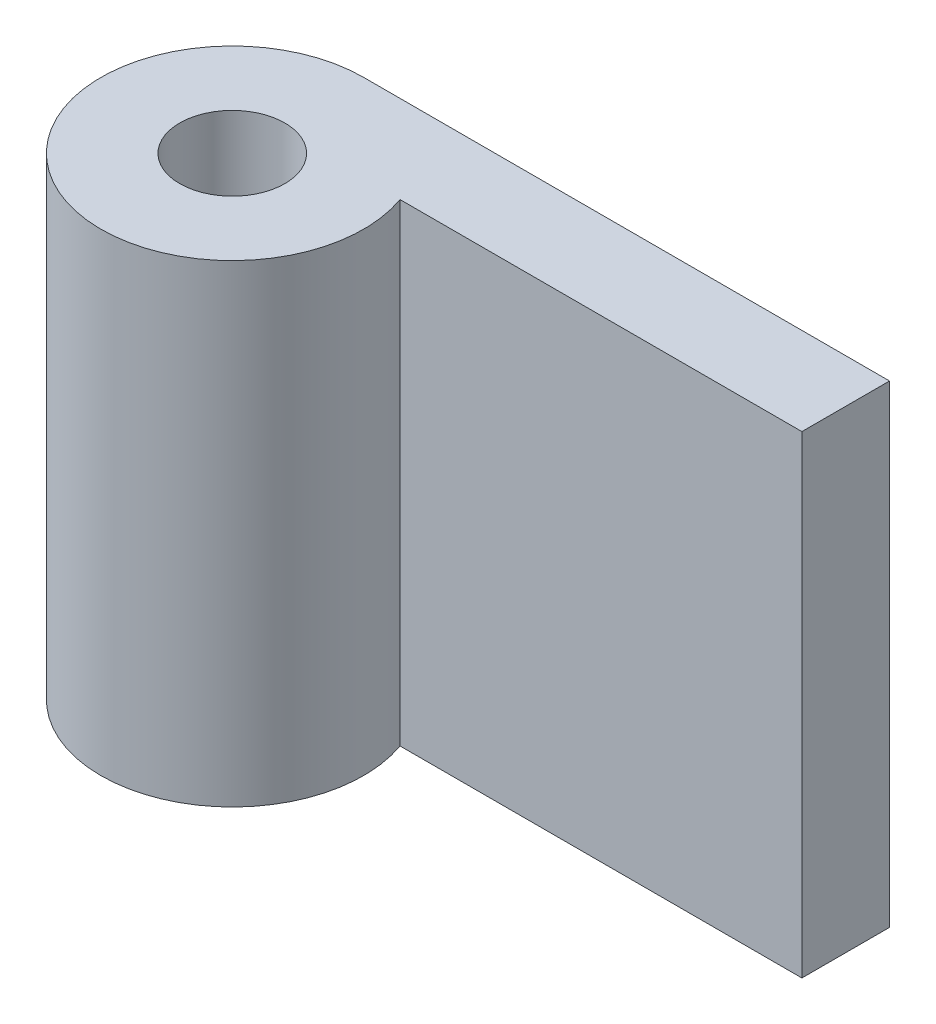
ISO-10303-21;
HEADER;
FILE_DESCRIPTION(('STEP AP214'),'2;1');
FILE_NAME('part.step','',(''),(''),'','','');
FILE_SCHEMA(('AUTOMOTIVE_DESIGN { 1 0 10303 214 1 1 1 1 }'));
ENDSEC;
DATA;
#1=APPLICATION_CONTEXT('core data for automotive mechanical design processes');
#2=APPLICATION_PROTOCOL_DEFINITION('international standard','automotive_design',2000,#1);
#3=PRODUCT_CONTEXT('',#1,'mechanical');
#4=PRODUCT('Part','Part','',(#3));
#5=PRODUCT_RELATED_PRODUCT_CATEGORY('part','',(#4));
#6=PRODUCT_DEFINITION_FORMATION('','',#4);
#7=PRODUCT_DEFINITION_CONTEXT('part definition',#1,'design');
#8=PRODUCT_DEFINITION('design','',#6,#7);
#9=PRODUCT_DEFINITION_SHAPE('','',#8);
#10=(LENGTH_UNIT() NAMED_UNIT(*) SI_UNIT(.MILLI.,.METRE.));
#11=(NAMED_UNIT(*) PLANE_ANGLE_UNIT() SI_UNIT($,.RADIAN.));
#12=(NAMED_UNIT(*) SI_UNIT($,.STERADIAN.) SOLID_ANGLE_UNIT());
#13=UNCERTAINTY_MEASURE_WITH_UNIT(LENGTH_MEASURE(1.E-05),#10,'distance_accuracy_value','');
#14=(GEOMETRIC_REPRESENTATION_CONTEXT(3) GLOBAL_UNCERTAINTY_ASSIGNED_CONTEXT((#13)) GLOBAL_UNIT_ASSIGNED_CONTEXT((#10,
#11,#12)) REPRESENTATION_CONTEXT('',''));
#15=CARTESIAN_POINT('',(0.,0.,0.));
#16=DIRECTION('',(0.,0.,1.));
#17=DIRECTION('',(1.,0.,0.));
#18=AXIS2_PLACEMENT_3D('',#15,#16,#17);
#19=CARTESIAN_POINT('',(0.,10.8,0.));
#20=DIRECTION('',(0.,-1.,0.));
#21=DIRECTION('',(0.,0.,-1.));
#22=AXIS2_PLACEMENT_3D('',#19,#20,#21);
#23=CYLINDRICAL_SURFACE('',#22,3.);
#24=DIRECTION('',(0.,-1.,0.));
#25=VECTOR('',#24,1.);
#26=CARTESIAN_POINT('',(2.82842712474619,10.8,-0.999999999999999));
#27=LINE('',#26,#25);
#28=CARTESIAN_POINT('',(2.82842712474619,10.8,-0.999999999999999));
#29=VERTEX_POINT('',#28);
#30=CARTESIAN_POINT('',(2.82842712474619,0.,-1.));
#31=VERTEX_POINT('',#30);
#32=EDGE_CURVE('E58',#29,#31,#27,.T.);
#33=ORIENTED_EDGE('',*,*,#32,.F.);
#34=CARTESIAN_POINT('',(0.,10.8,0.));
#35=DIRECTION('',(0.,1.,0.));
#36=DIRECTION('',(0.,0.,1.));
#37=AXIS2_PLACEMENT_3D('',#34,#35,#36);
#38=CIRCLE('',#37,3.);
#39=CARTESIAN_POINT('',(0.,10.8,-3.));
#40=VERTEX_POINT('',#39);
#41=EDGE_CURVE('E11',#40,#29,#38,.T.);
#42=ORIENTED_EDGE('',*,*,#41,.F.);
#43=DIRECTION('',(0.,1.,0.));
#44=VECTOR('',#43,1.);
#45=CARTESIAN_POINT('',(0.,10.8,-3.));
#46=LINE('',#45,#44);
#47=CARTESIAN_POINT('',(0.,0.,-3.));
#48=VERTEX_POINT('',#47);
#49=EDGE_CURVE('E62',#48,#40,#46,.T.);
#50=ORIENTED_EDGE('',*,*,#49,.F.);
#51=CARTESIAN_POINT('',(0.,0.,0.));
#52=DIRECTION('',(0.,1.,0.));
#53=DIRECTION('',(0.,0.,1.));
#54=AXIS2_PLACEMENT_3D('',#51,#52,#53);
#55=CIRCLE('',#54,3.);
#56=EDGE_CURVE('E46',#48,#31,#55,.T.);
#57=ORIENTED_EDGE('',*,*,#56,.T.);
#58=EDGE_LOOP('',(#33,#42,#50,#57));
#59=FACE_BOUND('',#58,.T.);
#60=ADVANCED_FACE('F43',(#59),#23,.T.);
#61=CARTESIAN_POINT('',(0.,10.8,0.));
#62=DIRECTION('',(0.,1.,0.));
#63=DIRECTION('',(0.,0.,1.));
#64=AXIS2_PLACEMENT_3D('',#61,#62,#63);
#65=PLANE('',#64);
#66=CARTESIAN_POINT('',(0.,10.8,0.));
#67=DIRECTION('',(0.,1.,0.));
#68=DIRECTION('',(0.,0.,1.));
#69=AXIS2_PLACEMENT_3D('',#66,#67,#68);
#70=CIRCLE('',#69,1.2);
#71=CARTESIAN_POINT('',(0.,10.8,1.2));
#72=VERTEX_POINT('',#71);
#73=EDGE_CURVE('E94',#72,#72,#70,.T.);
#74=ORIENTED_EDGE('',*,*,#73,.F.);
#75=EDGE_LOOP('',(#74));
#76=FACE_BOUND('',#75,.T.);
#77=ORIENTED_EDGE('',*,*,#41,.T.);
#78=DIRECTION('',(-1.,0.,0.));
#79=VECTOR('',#78,1.);
#80=CARTESIAN_POINT('',(12.,10.8,-0.999999999999999));
#81=LINE('',#80,#79);
#82=CARTESIAN_POINT('',(12.,10.8,-0.999999999999999));
#83=VERTEX_POINT('',#82);
#84=EDGE_CURVE('E114',#83,#29,#81,.T.);
#85=ORIENTED_EDGE('',*,*,#84,.F.);
#86=DIRECTION('',(0.,0.,1.));
#87=VECTOR('',#86,1.);
#88=CARTESIAN_POINT('',(12.,10.8,-0.999999999999999));
#89=LINE('',#88,#87);
#90=CARTESIAN_POINT('',(12.,10.8,-3.));
#91=VERTEX_POINT('',#90);
#92=EDGE_CURVE('E112',#91,#83,#89,.T.);
#93=ORIENTED_EDGE('',*,*,#92,.F.);
#94=DIRECTION('',(-1.,0.,0.));
#95=VECTOR('',#94,1.);
#96=CARTESIAN_POINT('',(12.,10.8,-3.));
#97=LINE('',#96,#95);
#98=EDGE_CURVE('E119',#91,#40,#97,.T.);
#99=ORIENTED_EDGE('',*,*,#98,.T.);
#100=EDGE_LOOP('',(#77,#85,#93,#99));
#101=FACE_BOUND('',#100,.T.);
#102=ADVANCED_FACE('F154',(#76,#101),#65,.T.);
#103=CARTESIAN_POINT('',(0.,0.,0.));
#104=DIRECTION('',(0.,1.,0.));
#105=DIRECTION('',(0.,0.,1.));
#106=AXIS2_PLACEMENT_3D('',#103,#104,#105);
#107=PLANE('',#106);
#108=ORIENTED_EDGE('',*,*,#56,.F.);
#109=DIRECTION('',(-1.,0.,0.));
#110=VECTOR('',#109,1.);
#111=CARTESIAN_POINT('',(12.,0.,-3.));
#112=LINE('',#111,#110);
#113=CARTESIAN_POINT('',(12.,0.,-3.));
#114=VERTEX_POINT('',#113);
#115=EDGE_CURVE('E123',#114,#48,#112,.T.);
#116=ORIENTED_EDGE('',*,*,#115,.F.);
#117=DIRECTION('',(0.,0.,-1.));
#118=VECTOR('',#117,1.);
#119=CARTESIAN_POINT('',(12.,0.,-1.));
#120=LINE('',#119,#118);
#121=CARTESIAN_POINT('',(12.,0.,-1.));
#122=VERTEX_POINT('',#121);
#123=EDGE_CURVE('E106',#122,#114,#120,.T.);
#124=ORIENTED_EDGE('',*,*,#123,.F.);
#125=DIRECTION('',(-1.,0.,0.));
#126=VECTOR('',#125,1.);
#127=CARTESIAN_POINT('',(12.,0.,-1.));
#128=LINE('',#127,#126);
#129=EDGE_CURVE('E127',#122,#31,#128,.T.);
#130=ORIENTED_EDGE('',*,*,#129,.T.);
#131=EDGE_LOOP('',(#108,#116,#124,#130));
#132=FACE_BOUND('',#131,.T.);
#133=ADVANCED_FACE('F137',(#132),#107,.F.);
#134=CARTESIAN_POINT('',(12.,10.8,-0.999999999999999));
#135=DIRECTION('',(0.,0.,-1.));
#136=DIRECTION('',(0.,1.,0.));
#137=AXIS2_PLACEMENT_3D('',#134,#135,#136);
#138=PLANE('',#137);
#139=ORIENTED_EDGE('',*,*,#84,.T.);
#140=ORIENTED_EDGE('',*,*,#32,.T.);
#141=ORIENTED_EDGE('',*,*,#129,.F.);
#142=DIRECTION('',(0.,-1.,0.));
#143=VECTOR('',#142,1.);
#144=CARTESIAN_POINT('',(12.,10.8,-0.999999999999999));
#145=LINE('',#144,#143);
#146=EDGE_CURVE('E98',#83,#122,#145,.T.);
#147=ORIENTED_EDGE('',*,*,#146,.F.);
#148=EDGE_LOOP('',(#139,#140,#141,#147));
#149=FACE_BOUND('',#148,.T.);
#150=ADVANCED_FACE('F146',(#149),#138,.F.);
#151=CARTESIAN_POINT('',(12.,10.8,-3.));
#152=DIRECTION('',(0.,0.,1.));
#153=DIRECTION('',(1.,0.,0.));
#154=AXIS2_PLACEMENT_3D('',#151,#152,#153);
#155=PLANE('',#154);
#156=ORIENTED_EDGE('',*,*,#49,.T.);
#157=ORIENTED_EDGE('',*,*,#98,.F.);
#158=DIRECTION('',(0.,1.,0.));
#159=VECTOR('',#158,1.);
#160=CARTESIAN_POINT('',(12.,10.8,-3.));
#161=LINE('',#160,#159);
#162=EDGE_CURVE('E109',#114,#91,#161,.T.);
#163=ORIENTED_EDGE('',*,*,#162,.F.);
#164=ORIENTED_EDGE('',*,*,#115,.T.);
#165=EDGE_LOOP('',(#156,#157,#163,#164));
#166=FACE_BOUND('',#165,.T.);
#167=ADVANCED_FACE('F140',(#166),#155,.F.);
#168=CARTESIAN_POINT('',(12.,0.,0.));
#169=DIRECTION('',(1.,0.,0.));
#170=DIRECTION('',(0.,0.,-1.));
#171=AXIS2_PLACEMENT_3D('',#168,#169,#170);
#172=PLANE('',#171);
#173=ORIENTED_EDGE('',*,*,#146,.T.);
#174=ORIENTED_EDGE('',*,*,#123,.T.);
#175=ORIENTED_EDGE('',*,*,#162,.T.);
#176=ORIENTED_EDGE('',*,*,#92,.T.);
#177=EDGE_LOOP('',(#173,#174,#175,#176));
#178=FACE_BOUND('',#177,.T.);
#179=ADVANCED_FACE('F87',(#178),#172,.T.);
#180=CARTESIAN_POINT('',(0.,2.8,0.));
#181=DIRECTION('',(0.,1.,0.));
#182=DIRECTION('',(0.,0.,1.));
#183=AXIS2_PLACEMENT_3D('',#180,#181,#182);
#184=CONICAL_SURFACE('',#183,1.2,1.02974425867665);
#185=CARTESIAN_POINT('',(0.,2.07896725716693,0.));
#186=VERTEX_POINT('',#185);
#187=VERTEX_LOOP('',#186);
#188=FACE_BOUND('',#187,.T.);
#189=CARTESIAN_POINT('',(0.,2.8,0.));
#190=DIRECTION('',(0.,1.,0.));
#191=DIRECTION('',(0.,0.,1.));
#192=AXIS2_PLACEMENT_3D('',#189,#190,#191);
#193=CIRCLE('',#192,1.2);
#194=CARTESIAN_POINT('',(0.,2.8,1.2));
#195=VERTEX_POINT('',#194);
#196=EDGE_CURVE('E91',#195,#195,#193,.T.);
#197=ORIENTED_EDGE('',*,*,#196,.T.);
#198=EDGE_LOOP('',(#197));
#199=FACE_BOUND('',#198,.T.);
#200=ADVANCED_FACE('F83',(#188,#199),#184,.F.);
#201=CARTESIAN_POINT('',(0.,10.8,0.));
#202=DIRECTION('',(0.,1.,0.));
#203=DIRECTION('',(0.,0.,1.));
#204=AXIS2_PLACEMENT_3D('',#201,#202,#203);
#205=CYLINDRICAL_SURFACE('',#204,1.2);
#206=ORIENTED_EDGE('',*,*,#196,.F.);
#207=EDGE_LOOP('',(#206));
#208=FACE_BOUND('',#207,.T.);
#209=ORIENTED_EDGE('',*,*,#73,.T.);
#210=EDGE_LOOP('',(#209));
#211=FACE_BOUND('',#210,.T.);
#212=ADVANCED_FACE('F86',(#208,#211),#205,.F.);
#213=CLOSED_SHELL('',(#60,#102,#133,#150,#167,#179,#200,#212));
#214=MANIFOLD_SOLID_BREP('B2',#213);
#215=ADVANCED_BREP_SHAPE_REPRESENTATION('',(#18,#214),#14);
#216=SHAPE_DEFINITION_REPRESENTATION(#9,#215);
ENDSEC;
END-ISO-10303-21;
